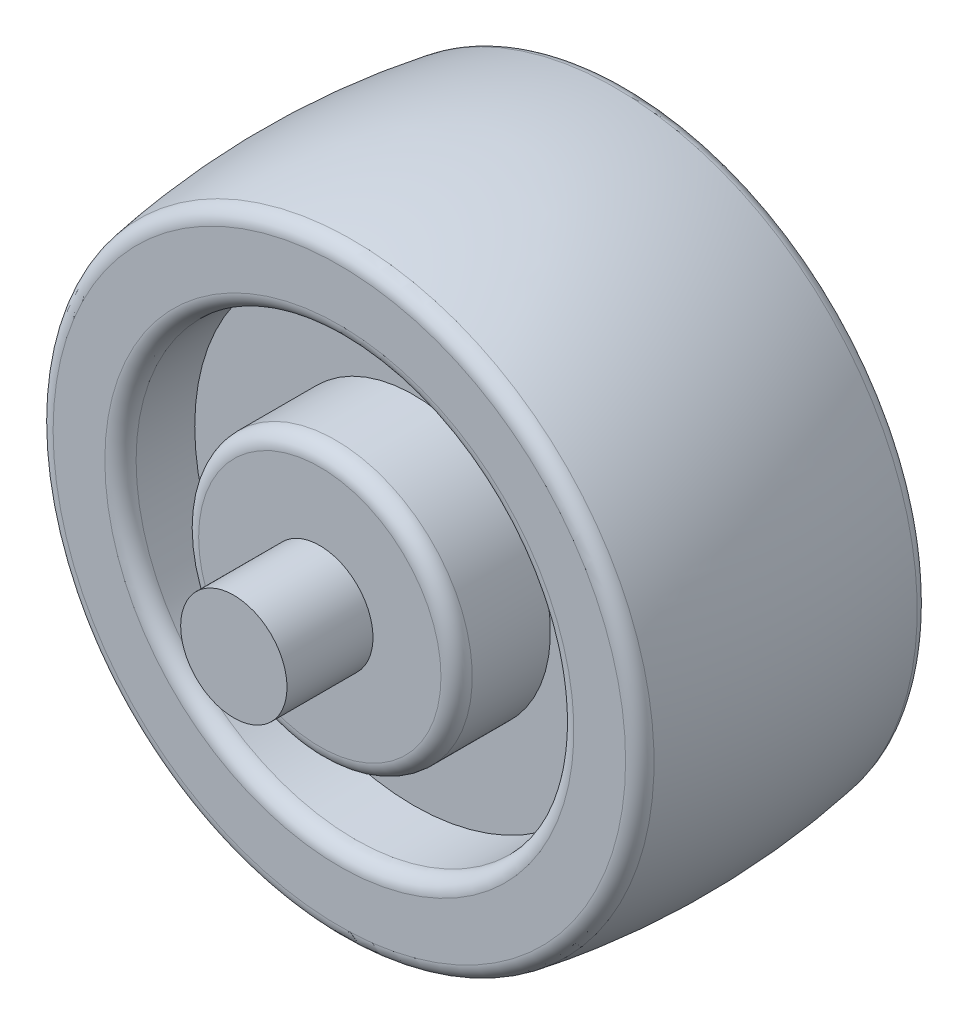
ISO-10303-21;
HEADER;
FILE_DESCRIPTION(('STEP AP214'),'2;1');
FILE_NAME('part.step','',(''),(''),'','','');
FILE_SCHEMA(('AUTOMOTIVE_DESIGN { 1 0 10303 214 1 1 1 1 }'));
ENDSEC;
DATA;
#1=APPLICATION_CONTEXT('core data for automotive mechanical design processes');
#2=APPLICATION_PROTOCOL_DEFINITION('international standard','automotive_design',2000,#1);
#3=PRODUCT_CONTEXT('',#1,'mechanical');
#4=PRODUCT('Part','Part','',(#3));
#5=PRODUCT_RELATED_PRODUCT_CATEGORY('part','',(#4));
#6=PRODUCT_DEFINITION_FORMATION('','',#4);
#7=PRODUCT_DEFINITION_CONTEXT('part definition',#1,'design');
#8=PRODUCT_DEFINITION('design','',#6,#7);
#9=PRODUCT_DEFINITION_SHAPE('','',#8);
#10=(LENGTH_UNIT() NAMED_UNIT(*) SI_UNIT(.MILLI.,.METRE.));
#11=(NAMED_UNIT(*) PLANE_ANGLE_UNIT() SI_UNIT($,.RADIAN.));
#12=(NAMED_UNIT(*) SI_UNIT($,.STERADIAN.) SOLID_ANGLE_UNIT());
#13=UNCERTAINTY_MEASURE_WITH_UNIT(LENGTH_MEASURE(1.E-05),#10,'distance_accuracy_value','');
#14=(GEOMETRIC_REPRESENTATION_CONTEXT(3) GLOBAL_UNCERTAINTY_ASSIGNED_CONTEXT((#13)) GLOBAL_UNIT_ASSIGNED_CONTEXT((#10,
#11,#12)) REPRESENTATION_CONTEXT('',''));
#15=CARTESIAN_POINT('',(0.,0.,0.));
#16=DIRECTION('',(0.,0.,1.));
#17=DIRECTION('',(1.,0.,0.));
#18=AXIS2_PLACEMENT_3D('',#15,#16,#17);
#19=CARTESIAN_POINT('',(0.,0.,-8.99999999999985));
#20=DIRECTION('',(0.,0.,-1.));
#21=DIRECTION('',(-1.,0.,0.));
#22=AXIS2_PLACEMENT_3D('',#19,#20,#21);
#23=DEGENERATE_TOROIDAL_SURFACE('',#22,1.39999999999985,2.00000000000015,.T.);
#24=CARTESIAN_POINT('',(-2.5,-1.07891413116129,-10.4999993737728));
#25=CARTESIAN_POINT('',(-2.5,-1.06285294349331,-10.5056119828645));
#26=CARTESIAN_POINT('',(-2.5,-1.04669158400781,-10.5110809645536));
#27=CARTESIAN_POINT('',(-2.5,-0.863880296138809,-10.5709997012819));
#28=CARTESIAN_POINT('',(-2.5,-0.69425513791531,-10.6087139897874));
#29=CARTESIAN_POINT('',(-2.5,-0.348366003671523,-10.6585810203156));
#30=CARTESIAN_POINT('',(-2.5,-0.174223843179735,-10.6703293088489));
#31=CARTESIAN_POINT('',(-2.5,0.183884168630542,-10.6703293088489));
#32=CARTESIAN_POINT('',(-2.5,0.366145032993408,-10.6573559735582));
#33=CARTESIAN_POINT('',(-2.5,0.728578946840113,-10.6022205843897));
#34=CARTESIAN_POINT('',(-2.5,0.905925810709308,-10.5604503184748));
#35=CARTESIAN_POINT('',(-2.5,1.0789126789543,-10.4999998812421));
#36=B_SPLINE_CURVE_WITH_KNOTS('',3,(#24,#25,#26,#27,#28,#29,#30,#31,#32,#33,#34,#35),
.UNSPECIFIED.,.F.,.F.,(4,2,2,2,2,4),(11.4128770088824,11.4629135358959,11.9802909447386,
12.4976683535814,13.0437331915332,13.5897980294849),.UNSPECIFIED.);
#37=CARTESIAN_POINT('',(-2.5,-1.07891233911283,-10.5));
#38=VERTEX_POINT('',#37);
#39=CARTESIAN_POINT('',(-2.5,1.07891233911283,-10.5));
#40=VERTEX_POINT('',#39);
#41=EDGE_CURVE('E120',#38,#40,#36,.T.);
#42=ORIENTED_EDGE('',*,*,#41,.F.);
#43=CARTESIAN_POINT('',(0.,0.,-10.5));
#44=DIRECTION('',(0.,0.,1.));
#45=DIRECTION('',(-0.918146957948897,0.39624003281999,0.));
#46=AXIS2_PLACEMENT_3D('',#43,#44,#45);
#47=CIRCLE('',#46,2.7228756555322);
#48=EDGE_CURVE('E107',#40,#38,#47,.T.);
#49=ORIENTED_EDGE('',*,*,#48,.F.);
#50=EDGE_LOOP('',(#42,#49));
#51=FACE_BOUND('',#50,.T.);
#52=ADVANCED_FACE('F16',(#51),#23,.T.);
#53=CARTESIAN_POINT('',(-2.5,2.17,-16.));
#54=DIRECTION('',(-1.,0.,0.));
#55=DIRECTION('',(0.,0.,1.));
#56=AXIS2_PLACEMENT_3D('',#53,#54,#55);
#57=PLANE('',#56);
#58=DIRECTION('',(0.,-1.,0.));
#59=VECTOR('',#58,1.);
#60=CARTESIAN_POINT('',(-2.5,2.17,-10.5));
#61=LINE('',#60,#59);
#62=CARTESIAN_POINT('',(-2.5,2.17,-10.5));
#63=VERTEX_POINT('',#62);
#64=EDGE_CURVE('E116',#63,#40,#61,.T.);
#65=ORIENTED_EDGE('',*,*,#64,.F.);
#66=DIRECTION('',(0.,0.,1.));
#67=VECTOR('',#66,1.);
#68=CARTESIAN_POINT('',(-2.5,2.17,-16.));
#69=LINE('',#68,#67);
#70=CARTESIAN_POINT('',(-2.5,2.17,-16.));
#71=VERTEX_POINT('',#70);
#72=EDGE_CURVE('E475',#71,#63,#69,.T.);
#73=ORIENTED_EDGE('',*,*,#72,.F.);
#74=DIRECTION('',(0.,-1.,0.));
#75=VECTOR('',#74,1.);
#76=CARTESIAN_POINT('',(-2.5,2.17,-16.));
#77=LINE('',#76,#75);
#78=CARTESIAN_POINT('',(-2.5,-2.17,-16.));
#79=VERTEX_POINT('',#78);
#80=EDGE_CURVE('E493',#71,#79,#77,.T.);
#81=ORIENTED_EDGE('',*,*,#80,.T.);
#82=DIRECTION('',(0.,0.,1.));
#83=VECTOR('',#82,1.);
#84=CARTESIAN_POINT('',(-2.5,-2.17,-16.));
#85=LINE('',#84,#83);
#86=CARTESIAN_POINT('',(-2.5,-2.17,-10.5));
#87=VERTEX_POINT('',#86);
#88=EDGE_CURVE('E127',#79,#87,#85,.T.);
#89=ORIENTED_EDGE('',*,*,#88,.T.);
#90=DIRECTION('',(0.,-1.,0.));
#91=VECTOR('',#90,1.);
#92=CARTESIAN_POINT('',(-2.5,-1.07891233911283,-10.5));
#93=LINE('',#92,#91);
#94=EDGE_CURVE('E113',#38,#87,#93,.T.);
#95=ORIENTED_EDGE('',*,*,#94,.F.);
#96=ORIENTED_EDGE('',*,*,#41,.T.);
#97=EDGE_LOOP('',(#65,#73,#81,#89,#95,#96));
#98=FACE_BOUND('',#97,.T.);
#99=ADVANCED_FACE('F124',(#98),#57,.T.);
#100=CARTESIAN_POINT('',(0.,7.75,-10.5));
#101=DIRECTION('',(0.,0.,1.));
#102=DIRECTION('',(1.,0.,0.));
#103=AXIS2_PLACEMENT_3D('',#100,#101,#102);
#104=PLANE('',#103);
#105=DIRECTION('',(-1.,0.,0.));
#106=VECTOR('',#105,1.);
#107=CARTESIAN_POINT('',(2.17,2.5,-10.5));
#108=LINE('',#107,#106);
#109=CARTESIAN_POINT('',(2.17,2.5,-10.5));
#110=VERTEX_POINT('',#109);
#111=CARTESIAN_POINT('',(1.07891233911283,2.5,-10.5));
#112=VERTEX_POINT('',#111);
#113=EDGE_CURVE('E128',#110,#112,#108,.T.);
#114=ORIENTED_EDGE('',*,*,#113,.T.);
#115=CARTESIAN_POINT('',(0.,0.,-10.5));
#116=DIRECTION('',(0.,0.,1.));
#117=DIRECTION('',(0.396240032819989,0.918146957948897,0.));
#118=AXIS2_PLACEMENT_3D('',#115,#116,#117);
#119=CIRCLE('',#118,2.7228756555322);
#120=CARTESIAN_POINT('',(-1.07891233911283,2.5,-10.5));
#121=VERTEX_POINT('',#120);
#122=EDGE_CURVE('E480',#112,#121,#119,.T.);
#123=ORIENTED_EDGE('',*,*,#122,.T.);
#124=DIRECTION('',(-1.,0.,0.));
#125=VECTOR('',#124,1.);
#126=CARTESIAN_POINT('',(-1.07891233911283,2.5,-10.5));
#127=LINE('',#126,#125);
#128=CARTESIAN_POINT('',(-2.17,2.5,-10.5));
#129=VERTEX_POINT('',#128);
#130=EDGE_CURVE('E477',#121,#129,#127,.T.);
#131=ORIENTED_EDGE('',*,*,#130,.T.);
#132=CARTESIAN_POINT('',(-2.17000000000013,2.17000000000013,-10.5));
#133=DIRECTION('',(0.,0.,1.));
#134=DIRECTION('',(4.09100363013557E-13,1.,0.));
#135=AXIS2_PLACEMENT_3D('',#132,#133,#134);
#136=CIRCLE('',#135,0.329999999999866);
#137=EDGE_CURVE('E474',#129,#63,#136,.T.);
#138=ORIENTED_EDGE('',*,*,#137,.T.);
#139=ORIENTED_EDGE('',*,*,#64,.T.);
#140=ORIENTED_EDGE('',*,*,#48,.T.);
#141=ORIENTED_EDGE('',*,*,#94,.T.);
#142=CARTESIAN_POINT('',(-2.17000000000013,-2.17000000000013,-10.5));
#143=DIRECTION('',(0.,0.,1.));
#144=DIRECTION('',(-1.,4.09100363013557E-13,0.));
#145=AXIS2_PLACEMENT_3D('',#142,#143,#144);
#146=CIRCLE('',#145,0.329999999999866);
#147=CARTESIAN_POINT('',(-2.17,-2.5,-10.5));
#148=VERTEX_POINT('',#147);
#149=EDGE_CURVE('E476',#87,#148,#146,.T.);
#150=ORIENTED_EDGE('',*,*,#149,.T.);
#151=DIRECTION('',(1.,0.,0.));
#152=VECTOR('',#151,1.);
#153=CARTESIAN_POINT('',(-2.17,-2.5,-10.5));
#154=LINE('',#153,#152);
#155=CARTESIAN_POINT('',(-1.07891233911283,-2.5,-10.5));
#156=VERTEX_POINT('',#155);
#157=EDGE_CURVE('E441',#148,#156,#154,.T.);
#158=ORIENTED_EDGE('',*,*,#157,.T.);
#159=CARTESIAN_POINT('',(0.,0.,-10.5));
#160=DIRECTION('',(0.,0.,1.));
#161=DIRECTION('',(-0.39624003281999,-0.918146957948897,0.));
#162=AXIS2_PLACEMENT_3D('',#159,#160,#161);
#163=CIRCLE('',#162,2.7228756555322);
#164=CARTESIAN_POINT('',(1.07891233911283,-2.5,-10.5));
#165=VERTEX_POINT('',#164);
#166=EDGE_CURVE('E437',#156,#165,#163,.T.);
#167=ORIENTED_EDGE('',*,*,#166,.T.);
#168=DIRECTION('',(1.,0.,0.));
#169=VECTOR('',#168,1.);
#170=CARTESIAN_POINT('',(1.07891233911283,-2.5,-10.5));
#171=LINE('',#170,#169);
#172=CARTESIAN_POINT('',(2.17,-2.5,-10.5));
#173=VERTEX_POINT('',#172);
#174=EDGE_CURVE('E433',#165,#173,#171,.T.);
#175=ORIENTED_EDGE('',*,*,#174,.T.);
#176=CARTESIAN_POINT('',(2.17000000000013,-2.17000000000013,-10.5));
#177=DIRECTION('',(0.,0.,1.));
#178=DIRECTION('',(-4.09100363013557E-13,-1.,0.));
#179=AXIS2_PLACEMENT_3D('',#176,#177,#178);
#180=CIRCLE('',#179,0.329999999999866);
#181=CARTESIAN_POINT('',(2.5,-2.17,-10.5));
#182=VERTEX_POINT('',#181);
#183=EDGE_CURVE('E436',#173,#182,#180,.T.);
#184=ORIENTED_EDGE('',*,*,#183,.T.);
#185=DIRECTION('',(0.,1.,0.));
#186=VECTOR('',#185,1.);
#187=CARTESIAN_POINT('',(2.5,-2.17,-10.5));
#188=LINE('',#187,#186);
#189=CARTESIAN_POINT('',(2.5,-1.07891233911283,-10.5));
#190=VERTEX_POINT('',#189);
#191=EDGE_CURVE('E439',#182,#190,#188,.T.);
#192=ORIENTED_EDGE('',*,*,#191,.T.);
#193=CARTESIAN_POINT('',(0.,0.,-10.5));
#194=DIRECTION('',(0.,0.,1.));
#195=DIRECTION('',(0.918146957948897,-0.39624003281999,0.));
#196=AXIS2_PLACEMENT_3D('',#193,#194,#195);
#197=CIRCLE('',#196,2.7228756555322);
#198=CARTESIAN_POINT('',(2.5,1.07891233911283,-10.5));
#199=VERTEX_POINT('',#198);
#200=EDGE_CURVE('E451',#190,#199,#197,.T.);
#201=ORIENTED_EDGE('',*,*,#200,.T.);
#202=DIRECTION('',(0.,1.,0.));
#203=VECTOR('',#202,1.);
#204=CARTESIAN_POINT('',(2.5,1.07891233911283,-10.5));
#205=LINE('',#204,#203);
#206=CARTESIAN_POINT('',(2.5,2.17000000000013,-10.5));
#207=VERTEX_POINT('',#206);
#208=EDGE_CURVE('E342',#199,#207,#205,.T.);
#209=ORIENTED_EDGE('',*,*,#208,.T.);
#210=CARTESIAN_POINT('',(2.17000000000013,2.17000000000013,-10.5));
#211=DIRECTION('',(0.,0.,1.));
#212=DIRECTION('',(1.,0.,0.));
#213=AXIS2_PLACEMENT_3D('',#210,#211,#212);
#214=CIRCLE('',#213,0.329999999999866);
#215=EDGE_CURVE('E337',#207,#110,#214,.T.);
#216=ORIENTED_EDGE('',*,*,#215,.T.);
#217=EDGE_LOOP('',(#114,#123,#131,#138,#139,#140,#141,#150,#158,#167,#175,#184,#192,#201,#209,#216));
#218=FACE_BOUND('',#217,.T.);
#219=CARTESIAN_POINT('',(0.,0.,-10.5));
#220=DIRECTION('',(0.,0.,-1.));
#221=DIRECTION('',(-1.,0.,0.));
#222=AXIS2_PLACEMENT_3D('',#219,#220,#221);
#223=CIRCLE('',#222,7.74999995529721);
#224=CARTESIAN_POINT('',(-7.74999995529721,0.,-10.5));
#225=VERTEX_POINT('',#224);
#226=EDGE_CURVE('E335',#225,#225,#223,.T.);
#227=ORIENTED_EDGE('',*,*,#226,.T.);
#228=EDGE_LOOP('',(#227));
#229=FACE_BOUND('',#228,.T.);
#230=ADVANCED_FACE('F110',(#218,#229),#104,.F.);
#231=CARTESIAN_POINT('',(-2.17000000000013,2.17000000000013,-16.));
#232=DIRECTION('',(0.,0.,1.));
#233=DIRECTION('',(1.,0.,0.));
#234=AXIS2_PLACEMENT_3D('',#231,#232,#233);
#235=CYLINDRICAL_SURFACE('',#234,0.329999999999866);
#236=ORIENTED_EDGE('',*,*,#137,.F.);
#237=DIRECTION('',(0.,0.,1.));
#238=VECTOR('',#237,1.);
#239=CARTESIAN_POINT('',(-2.17,2.5,-16.));
#240=LINE('',#239,#238);
#241=CARTESIAN_POINT('',(-2.17,2.5,-16.));
#242=VERTEX_POINT('',#241);
#243=EDGE_CURVE('E336',#242,#129,#240,.T.);
#244=ORIENTED_EDGE('',*,*,#243,.F.);
#245=CARTESIAN_POINT('',(-2.17000000000013,2.17000000000013,-16.));
#246=DIRECTION('',(0.,0.,1.));
#247=DIRECTION('',(4.09100363013557E-13,1.,0.));
#248=AXIS2_PLACEMENT_3D('',#245,#246,#247);
#249=CIRCLE('',#248,0.329999999999866);
#250=EDGE_CURVE('E339',#242,#71,#249,.T.);
#251=ORIENTED_EDGE('',*,*,#250,.T.);
#252=ORIENTED_EDGE('',*,*,#72,.T.);
#253=EDGE_LOOP('',(#236,#244,#251,#252));
#254=FACE_BOUND('',#253,.T.);
#255=ADVANCED_FACE('F472',(#254),#235,.T.);
#256=CARTESIAN_POINT('',(-2.17000000000013,-2.17000000000013,-16.));
#257=DIRECTION('',(0.,0.,1.));
#258=DIRECTION('',(1.,0.,0.));
#259=AXIS2_PLACEMENT_3D('',#256,#257,#258);
#260=PLANE('',#259);
#261=ORIENTED_EDGE('',*,*,#80,.F.);
#262=ORIENTED_EDGE('',*,*,#250,.F.);
#263=DIRECTION('',(-1.,0.,0.));
#264=VECTOR('',#263,1.);
#265=CARTESIAN_POINT('',(2.17,2.5,-16.));
#266=LINE('',#265,#264);
#267=CARTESIAN_POINT('',(2.17,2.5,-16.));
#268=VERTEX_POINT('',#267);
#269=EDGE_CURVE('E351',#268,#242,#266,.T.);
#270=ORIENTED_EDGE('',*,*,#269,.F.);
#271=CARTESIAN_POINT('',(2.17000000000013,2.17000000000013,-16.));
#272=DIRECTION('',(0.,0.,1.));
#273=DIRECTION('',(1.,0.,0.));
#274=AXIS2_PLACEMENT_3D('',#271,#272,#273);
#275=CIRCLE('',#274,0.329999999999866);
#276=CARTESIAN_POINT('',(2.5,2.17,-16.));
#277=VERTEX_POINT('',#276);
#278=EDGE_CURVE('E355',#277,#268,#275,.T.);
#279=ORIENTED_EDGE('',*,*,#278,.F.);
#280=DIRECTION('',(0.,1.,0.));
#281=VECTOR('',#280,1.);
#282=CARTESIAN_POINT('',(2.5,-2.17,-16.));
#283=LINE('',#282,#281);
#284=CARTESIAN_POINT('',(2.5,-2.17,-16.));
#285=VERTEX_POINT('',#284);
#286=EDGE_CURVE('E359',#285,#277,#283,.T.);
#287=ORIENTED_EDGE('',*,*,#286,.F.);
#288=CARTESIAN_POINT('',(2.17000000000013,-2.17000000000013,-16.));
#289=DIRECTION('',(0.,0.,1.));
#290=DIRECTION('',(-4.09100363013557E-13,-1.,0.));
#291=AXIS2_PLACEMENT_3D('',#288,#289,#290);
#292=CIRCLE('',#291,0.329999999999866);
#293=CARTESIAN_POINT('',(2.17,-2.5,-16.));
#294=VERTEX_POINT('',#293);
#295=EDGE_CURVE('E364',#294,#285,#292,.T.);
#296=ORIENTED_EDGE('',*,*,#295,.F.);
#297=DIRECTION('',(1.,0.,0.));
#298=VECTOR('',#297,1.);
#299=CARTESIAN_POINT('',(-2.17,-2.5,-16.));
#300=LINE('',#299,#298);
#301=CARTESIAN_POINT('',(-2.17,-2.5,-16.));
#302=VERTEX_POINT('',#301);
#303=EDGE_CURVE('E368',#302,#294,#300,.T.);
#304=ORIENTED_EDGE('',*,*,#303,.F.);
#305=CARTESIAN_POINT('',(-2.17000000000013,-2.17000000000013,-16.));
#306=DIRECTION('',(0.,0.,1.));
#307=DIRECTION('',(-1.,4.09100363013557E-13,0.));
#308=AXIS2_PLACEMENT_3D('',#305,#306,#307);
#309=CIRCLE('',#308,0.329999999999866);
#310=EDGE_CURVE('E372',#79,#302,#309,.T.);
#311=ORIENTED_EDGE('',*,*,#310,.F.);
#312=EDGE_LOOP('',(#261,#262,#270,#279,#287,#296,#304,#311));
#313=FACE_BOUND('',#312,.T.);
#314=ADVANCED_FACE('F466',(#313),#260,.F.);
#315=CARTESIAN_POINT('',(-2.17000000000013,-2.17000000000013,-16.));
#316=DIRECTION('',(0.,0.,1.));
#317=DIRECTION('',(1.,0.,0.));
#318=AXIS2_PLACEMENT_3D('',#315,#316,#317);
#319=CYLINDRICAL_SURFACE('',#318,0.329999999999866);
#320=ORIENTED_EDGE('',*,*,#149,.F.);
#321=ORIENTED_EDGE('',*,*,#88,.F.);
#322=ORIENTED_EDGE('',*,*,#310,.T.);
#323=DIRECTION('',(0.,0.,1.));
#324=VECTOR('',#323,1.);
#325=CARTESIAN_POINT('',(-2.17,-2.5,-16.));
#326=LINE('',#325,#324);
#327=EDGE_CURVE('E31',#302,#148,#326,.T.);
#328=ORIENTED_EDGE('',*,*,#327,.T.);
#329=EDGE_LOOP('',(#320,#321,#322,#328));
#330=FACE_BOUND('',#329,.T.);
#331=ADVANCED_FACE('F405',(#330),#319,.T.);
#332=CARTESIAN_POINT('',(2.17,2.5,-16.));
#333=DIRECTION('',(0.,1.,0.));
#334=DIRECTION('',(0.,0.,1.));
#335=AXIS2_PLACEMENT_3D('',#332,#333,#334);
#336=PLANE('',#335);
#337=ORIENTED_EDGE('',*,*,#113,.F.);
#338=DIRECTION('',(0.,0.,1.));
#339=VECTOR('',#338,1.);
#340=CARTESIAN_POINT('',(2.17,2.5,-16.));
#341=LINE('',#340,#339);
#342=EDGE_CURVE('E380',#268,#110,#341,.T.);
#343=ORIENTED_EDGE('',*,*,#342,.F.);
#344=ORIENTED_EDGE('',*,*,#269,.T.);
#345=ORIENTED_EDGE('',*,*,#243,.T.);
#346=ORIENTED_EDGE('',*,*,#130,.F.);
#347=CARTESIAN_POINT('',(-1.07891413116129,2.5,-10.4999993737728));
#348=CARTESIAN_POINT('',(-1.06285294349331,2.5,-10.5056119828645));
#349=CARTESIAN_POINT('',(-1.04669158400781,2.5,-10.5110809645536));
#350=CARTESIAN_POINT('',(-0.863880296138806,2.5,-10.5709997012819));
#351=CARTESIAN_POINT('',(-0.694255137915307,2.5,-10.6087139897874));
#352=CARTESIAN_POINT('',(-0.348366003671525,2.5,-10.6585810203156));
#353=CARTESIAN_POINT('',(-0.174223843179749,2.5,-10.6703293088489));
#354=CARTESIAN_POINT('',(0.183884168630528,2.5,-10.6703293088489));
#355=CARTESIAN_POINT('',(0.366619874414254,2.5,-10.6572837381367));
#356=CARTESIAN_POINT('',(0.637733047668014,2.5,-10.6160405493926));
#357=CARTESIAN_POINT('',(0.726584260967987,2.5,-10.5988183872929));
#358=CARTESIAN_POINT('',(0.859597647037045,2.5,-10.5666727702142));
#359=CARTESIAN_POINT('',(0.903679885365165,2.5,-10.5549447412132));
#360=CARTESIAN_POINT('',(0.991636632178508,2.5,-10.5291963207627));
#361=CARTESIAN_POINT('',(1.03552596041097,2.5,-10.5151614142107));
#362=CARTESIAN_POINT('',(1.0789126789543,2.5,-10.4999998812421));
#363=B_SPLINE_CURVE_WITH_KNOTS('',3,(#347,#348,#349,#350,#351,#352,#353,#354,#355,#356,#357,
#358,#359,#360,#361,#362),.UNSPECIFIED.,.F.,.F.,(4,2,2,2,2,2,2,4),(11.4128770088824,
11.4629135358959,11.9802909447387,12.4976683535814,13.0437331915332,13.3167656105091,
13.453281819997,13.5897980294849),.UNSPECIFIED.);
#364=EDGE_CURVE('E384',#121,#112,#363,.T.);
#365=ORIENTED_EDGE('',*,*,#364,.T.);
#366=EDGE_LOOP('',(#337,#343,#344,#345,#346,#365));
#367=FACE_BOUND('',#366,.T.);
#368=ADVANCED_FACE('F396',(#367),#336,.T.);
#369=ORIENTED_EDGE('',*,*,#364,.F.);
#370=ORIENTED_EDGE('',*,*,#122,.F.);
#371=EDGE_LOOP('',(#369,#370));
#372=FACE_BOUND('',#371,.T.);
#373=ADVANCED_FACE('F145',(#372),#23,.T.);
#374=CARTESIAN_POINT('',(-2.17,-2.5,-16.));
#375=DIRECTION('',(0.,-1.,0.));
#376=DIRECTION('',(0.,0.,-1.));
#377=AXIS2_PLACEMENT_3D('',#374,#375,#376);
#378=PLANE('',#377);
#379=ORIENTED_EDGE('',*,*,#157,.F.);
#380=ORIENTED_EDGE('',*,*,#327,.F.);
#381=ORIENTED_EDGE('',*,*,#303,.T.);
#382=DIRECTION('',(0.,0.,1.));
#383=VECTOR('',#382,1.);
#384=CARTESIAN_POINT('',(2.17,-2.5,-16.));
#385=LINE('',#384,#383);
#386=EDGE_CURVE('E39',#294,#173,#385,.T.);
#387=ORIENTED_EDGE('',*,*,#386,.T.);
#388=ORIENTED_EDGE('',*,*,#174,.F.);
#389=CARTESIAN_POINT('',(1.07891413116129,-2.5,-10.4999993737728));
#390=CARTESIAN_POINT('',(1.06285294349331,-2.5,-10.5056119828645));
#391=CARTESIAN_POINT('',(1.04669158400781,-2.5,-10.5110809645536));
#392=CARTESIAN_POINT('',(0.863880296138806,-2.5,-10.5709997012819));
#393=CARTESIAN_POINT('',(0.694255137915308,-2.5,-10.6087139897874));
#394=CARTESIAN_POINT('',(0.348366003671525,-2.5,-10.6585810203156));
#395=CARTESIAN_POINT('',(0.174223843179749,-2.5,-10.6703293088489));
#396=CARTESIAN_POINT('',(-0.183884168630529,-2.5,-10.6703293088489));
#397=CARTESIAN_POINT('',(-0.366619874414255,-2.5,-10.6572837381367));
#398=CARTESIAN_POINT('',(-0.637733047668015,-2.5,-10.6160405493926));
#399=CARTESIAN_POINT('',(-0.726584260967985,-2.5,-10.5988183872929));
#400=CARTESIAN_POINT('',(-0.859597647037045,-2.5,-10.5666727702142));
#401=CARTESIAN_POINT('',(-0.903679885365168,-2.5,-10.5549447412132));
#402=CARTESIAN_POINT('',(-0.991636632178511,-2.5,-10.5291963207627));
#403=CARTESIAN_POINT('',(-1.03552596041097,-2.5,-10.5151614142107));
#404=CARTESIAN_POINT('',(-1.0789126789543,-2.5,-10.4999998812421));
#405=B_SPLINE_CURVE_WITH_KNOTS('',3,(#389,#390,#391,#392,#393,#394,#395,#396,#397,#398,#399,
#400,#401,#402,#403,#404),.UNSPECIFIED.,.F.,.F.,(4,2,2,2,2,2,2,4),(11.4128770088824,
11.4629135358959,11.9802909447386,12.4976683535814,13.0437331915332,13.3167656105091,
13.453281819997,13.5897980294849),.UNSPECIFIED.);
#406=EDGE_CURVE('E172',#165,#156,#405,.T.);
#407=ORIENTED_EDGE('',*,*,#406,.T.);
#408=EDGE_LOOP('',(#379,#380,#381,#387,#388,#407));
#409=FACE_BOUND('',#408,.T.);
#410=ADVANCED_FACE('F407',(#409),#378,.T.);
#411=ORIENTED_EDGE('',*,*,#406,.F.);
#412=ORIENTED_EDGE('',*,*,#166,.F.);
#413=EDGE_LOOP('',(#411,#412));
#414=FACE_BOUND('',#413,.T.);
#415=ADVANCED_FACE('F410',(#414),#23,.T.);
#416=CARTESIAN_POINT('',(2.17000000000013,-2.17000000000013,-16.));
#417=DIRECTION('',(0.,0.,1.));
#418=DIRECTION('',(1.,0.,0.));
#419=AXIS2_PLACEMENT_3D('',#416,#417,#418);
#420=CYLINDRICAL_SURFACE('',#419,0.329999999999866);
#421=ORIENTED_EDGE('',*,*,#183,.F.);
#422=ORIENTED_EDGE('',*,*,#386,.F.);
#423=ORIENTED_EDGE('',*,*,#295,.T.);
#424=DIRECTION('',(0.,0.,1.));
#425=VECTOR('',#424,1.);
#426=CARTESIAN_POINT('',(2.5,-2.17,-16.));
#427=LINE('',#426,#425);
#428=EDGE_CURVE('E163',#285,#182,#427,.T.);
#429=ORIENTED_EDGE('',*,*,#428,.T.);
#430=EDGE_LOOP('',(#421,#422,#423,#429));
#431=FACE_BOUND('',#430,.T.);
#432=ADVANCED_FACE('F198',(#431),#420,.T.);
#433=CARTESIAN_POINT('',(2.5,-2.17,-16.));
#434=DIRECTION('',(1.,0.,0.));
#435=DIRECTION('',(0.,0.,-1.));
#436=AXIS2_PLACEMENT_3D('',#433,#434,#435);
#437=PLANE('',#436);
#438=ORIENTED_EDGE('',*,*,#191,.F.);
#439=ORIENTED_EDGE('',*,*,#428,.F.);
#440=ORIENTED_EDGE('',*,*,#286,.T.);
#441=DIRECTION('',(0.,0.,1.));
#442=VECTOR('',#441,1.);
#443=CARTESIAN_POINT('',(2.5,2.17,-16.));
#444=LINE('',#443,#442);
#445=EDGE_CURVE('E171',#277,#207,#444,.T.);
#446=ORIENTED_EDGE('',*,*,#445,.T.);
#447=ORIENTED_EDGE('',*,*,#208,.F.);
#448=CARTESIAN_POINT('',(2.5,1.07891413116129,-10.4999993737728));
#449=CARTESIAN_POINT('',(2.5,1.06285294349331,-10.5056119828645));
#450=CARTESIAN_POINT('',(2.5,1.04669158400781,-10.5110809645536));
#451=CARTESIAN_POINT('',(2.5,0.863880296138809,-10.5709997012819));
#452=CARTESIAN_POINT('',(2.5,0.694255137915308,-10.6087139897874));
#453=CARTESIAN_POINT('',(2.5,0.348366003671525,-10.6585810203156));
#454=CARTESIAN_POINT('',(2.5,0.174223843179749,-10.6703293088489));
#455=CARTESIAN_POINT('',(2.5,-0.183884168630529,-10.6703293088489));
#456=CARTESIAN_POINT('',(2.5,-0.366619874414255,-10.6572837381367));
#457=CARTESIAN_POINT('',(2.5,-0.637733047668015,-10.6160405493926));
#458=CARTESIAN_POINT('',(2.5,-0.726584260967986,-10.5988183872929));
#459=CARTESIAN_POINT('',(2.5,-0.859597647037045,-10.5666727702142));
#460=CARTESIAN_POINT('',(2.5,-0.903679885365167,-10.5549447412132));
#461=CARTESIAN_POINT('',(2.5,-0.991636632178509,-10.5291963207627));
#462=CARTESIAN_POINT('',(2.5,-1.03552596041097,-10.5151614142107));
#463=CARTESIAN_POINT('',(2.5,-1.0789126789543,-10.4999998812421));
#464=B_SPLINE_CURVE_WITH_KNOTS('',3,(#448,#449,#450,#451,#452,#453,#454,#455,#456,#457,#458,
#459,#460,#461,#462,#463),.UNSPECIFIED.,.F.,.F.,(4,2,2,2,2,2,2,4),(11.4128770088823,
11.4629135358959,11.9802909447386,12.4976683535814,13.0437331915332,13.316765610509,
13.453281819997,13.5897980294849),.UNSPECIFIED.);
#465=EDGE_CURVE('E177',#199,#190,#464,.T.);
#466=ORIENTED_EDGE('',*,*,#465,.T.);
#467=EDGE_LOOP('',(#438,#439,#440,#446,#447,#466));
#468=FACE_BOUND('',#467,.T.);
#469=ADVANCED_FACE('F188',(#468),#437,.T.);
#470=ORIENTED_EDGE('',*,*,#465,.F.);
#471=ORIENTED_EDGE('',*,*,#200,.F.);
#472=EDGE_LOOP('',(#470,#471));
#473=FACE_BOUND('',#472,.T.);
#474=ADVANCED_FACE('F144',(#473),#23,.T.);
#475=CARTESIAN_POINT('',(2.17000000000013,2.17000000000013,-16.));
#476=DIRECTION('',(0.,0.,1.));
#477=DIRECTION('',(1.,0.,0.));
#478=AXIS2_PLACEMENT_3D('',#475,#476,#477);
#479=CYLINDRICAL_SURFACE('',#478,0.329999999999866);
#480=ORIENTED_EDGE('',*,*,#215,.F.);
#481=ORIENTED_EDGE('',*,*,#445,.F.);
#482=ORIENTED_EDGE('',*,*,#278,.T.);
#483=ORIENTED_EDGE('',*,*,#342,.T.);
#484=EDGE_LOOP('',(#480,#481,#482,#483));
#485=FACE_BOUND('',#484,.T.);
#486=ADVANCED_FACE('F200',(#485),#479,.T.);
#487=CARTESIAN_POINT('',(0.,0.,-9.50000000000069));
#488=DIRECTION('',(0.,0.,-1.));
#489=DIRECTION('',(-1.,0.,0.));
#490=AXIS2_PLACEMENT_3D('',#487,#488,#489);
#491=TOROIDAL_SURFACE('',#490,7.75000000000069,0.99999999999931);
#492=CARTESIAN_POINT('',(0.,0.,-9.5));
#493=DIRECTION('',(0.,0.,-1.));
#494=DIRECTION('',(-1.,0.,0.));
#495=AXIS2_PLACEMENT_3D('',#492,#493,#494);
#496=CIRCLE('',#495,8.75);
#497=CARTESIAN_POINT('',(-8.75,0.,-9.5));
#498=VERTEX_POINT('',#497);
#499=EDGE_CURVE('E322',#498,#498,#496,.T.);
#500=ORIENTED_EDGE('',*,*,#499,.T.);
#501=EDGE_LOOP('',(#500));
#502=FACE_BOUND('',#501,.T.);
#503=ORIENTED_EDGE('',*,*,#226,.F.);
#504=EDGE_LOOP('',(#503));
#505=FACE_BOUND('',#504,.T.);
#506=ADVANCED_FACE('F203',(#502,#505),#491,.T.);
#507=CARTESIAN_POINT('',(0.,0.,-10.5));
#508=DIRECTION('',(0.,0.,-1.));
#509=DIRECTION('',(-1.,0.,0.));
#510=AXIS2_PLACEMENT_3D('',#507,#508,#509);
#511=CYLINDRICAL_SURFACE('',#510,8.75);
#512=ORIENTED_EDGE('',*,*,#499,.F.);
#513=EDGE_LOOP('',(#512));
#514=FACE_BOUND('',#513,.T.);
#515=CARTESIAN_POINT('',(0.,0.,-4.5));
#516=DIRECTION('',(0.,0.,-1.));
#517=DIRECTION('',(-1.,0.,0.));
#518=AXIS2_PLACEMENT_3D('',#515,#516,#517);
#519=CIRCLE('',#518,8.75);
#520=CARTESIAN_POINT('',(-8.75,0.,-4.5));
#521=VERTEX_POINT('',#520);
#522=EDGE_CURVE('E320',#521,#521,#519,.T.);
#523=ORIENTED_EDGE('',*,*,#522,.T.);
#524=EDGE_LOOP('',(#523));
#525=FACE_BOUND('',#524,.T.);
#526=ADVANCED_FACE('F207',(#514,#525),#511,.T.);
#527=CARTESIAN_POINT('',(0.,14.,-4.5));
#528=DIRECTION('',(0.,0.,1.));
#529=DIRECTION('',(1.,0.,0.));
#530=AXIS2_PLACEMENT_3D('',#527,#528,#529);
#531=PLANE('',#530);
#532=ORIENTED_EDGE('',*,*,#522,.F.);
#533=EDGE_LOOP('',(#532));
#534=FACE_BOUND('',#533,.T.);
#535=CARTESIAN_POINT('',(0.,0.,-4.5));
#536=DIRECTION('',(0.,0.,-1.));
#537=DIRECTION('',(-1.,0.,0.));
#538=AXIS2_PLACEMENT_3D('',#535,#536,#537);
#539=CIRCLE('',#538,14.);
#540=CARTESIAN_POINT('',(-14.,0.,-4.5));
#541=VERTEX_POINT('',#540);
#542=EDGE_CURVE('E317',#541,#541,#539,.T.);
#543=ORIENTED_EDGE('',*,*,#542,.T.);
#544=EDGE_LOOP('',(#543));
#545=FACE_BOUND('',#544,.T.);
#546=ADVANCED_FACE('F211',(#534,#545),#531,.F.);
#547=CARTESIAN_POINT('',(0.,0.,-10.5));
#548=DIRECTION('',(0.,0.,-1.));
#549=DIRECTION('',(-1.,0.,0.));
#550=AXIS2_PLACEMENT_3D('',#547,#548,#549);
#551=CYLINDRICAL_SURFACE('',#550,14.);
#552=ORIENTED_EDGE('',*,*,#542,.F.);
#553=EDGE_LOOP('',(#552));
#554=FACE_BOUND('',#553,.T.);
#555=CARTESIAN_POINT('',(0.,0.,-8.25));
#556=DIRECTION('',(0.,0.,-1.));
#557=DIRECTION('',(-1.,0.,0.));
#558=AXIS2_PLACEMENT_3D('',#555,#556,#557);
#559=CIRCLE('',#558,14.);
#560=CARTESIAN_POINT('',(-14.,0.,-8.25));
#561=VERTEX_POINT('',#560);
#562=EDGE_CURVE('E314',#561,#561,#559,.T.);
#563=ORIENTED_EDGE('',*,*,#562,.T.);
#564=EDGE_LOOP('',(#563));
#565=FACE_BOUND('',#564,.T.);
#566=ADVANCED_FACE('F215',(#554,#565),#551,.F.);
#567=CARTESIAN_POINT('',(0.,0.,-8.25000000000069));
#568=DIRECTION('',(0.,0.,-1.));
#569=DIRECTION('',(-1.,0.,0.));
#570=AXIS2_PLACEMENT_3D('',#567,#568,#569);
#571=TOROIDAL_SURFACE('',#570,14.9999999999993,0.999999999999307);
#572=CARTESIAN_POINT('',(0.,0.,-9.25));
#573=DIRECTION('',(0.,0.,-1.));
#574=DIRECTION('',(-1.,0.,0.));
#575=AXIS2_PLACEMENT_3D('',#572,#573,#574);
#576=CIRCLE('',#575,14.9999999999993);
#577=CARTESIAN_POINT('',(-14.9999999999993,0.,-9.25));
#578=VERTEX_POINT('',#577);
#579=EDGE_CURVE('E311',#578,#578,#576,.T.);
#580=ORIENTED_EDGE('',*,*,#579,.T.);
#581=EDGE_LOOP('',(#580));
#582=FACE_BOUND('',#581,.T.);
#583=ORIENTED_EDGE('',*,*,#562,.F.);
#584=EDGE_LOOP('',(#583));
#585=FACE_BOUND('',#584,.T.);
#586=ADVANCED_FACE('F219',(#582,#585),#571,.T.);
#587=CARTESIAN_POINT('',(0.,18.307658210572,-9.25));
#588=DIRECTION('',(0.,0.,1.));
#589=DIRECTION('',(1.,0.,0.));
#590=AXIS2_PLACEMENT_3D('',#587,#588,#589);
#591=PLANE('',#590);
#592=ORIENTED_EDGE('',*,*,#579,.F.);
#593=EDGE_LOOP('',(#592));
#594=FACE_BOUND('',#593,.T.);
#595=CARTESIAN_POINT('',(0.,0.,-9.25));
#596=DIRECTION('',(0.,0.,-1.));
#597=DIRECTION('',(-1.,0.,0.));
#598=AXIS2_PLACEMENT_3D('',#595,#596,#597);
#599=CIRCLE('',#598,18.3076581236845);
#600=CARTESIAN_POINT('',(-18.3076581236845,0.,-9.25));
#601=VERTEX_POINT('',#600);
#602=EDGE_CURVE('E308',#601,#601,#599,.T.);
#603=ORIENTED_EDGE('',*,*,#602,.T.);
#604=EDGE_LOOP('',(#603));
#605=FACE_BOUND('',#604,.T.);
#606=ADVANCED_FACE('F223',(#594,#605),#591,.F.);
#607=CARTESIAN_POINT('',(0.,0.,-8.25000000000082));
#608=DIRECTION('',(0.,0.,-1.));
#609=DIRECTION('',(-1.,0.,0.));
#610=AXIS2_PLACEMENT_3D('',#607,#608,#609);
#611=TOROIDAL_SURFACE('',#610,18.3076582105724,0.999999999999185);
#612=CARTESIAN_POINT('',(0.,0.,-8.4166666666667));
#613=DIRECTION('',(0.,0.,-1.));
#614=DIRECTION('',(-1.,0.,0.));
#615=AXIS2_PLACEMENT_3D('',#612,#613,#614);
#616=CIRCLE('',#615,19.293671507755);
#617=CARTESIAN_POINT('',(-19.293671507755,0.,-8.4166666666667));
#618=VERTEX_POINT('',#617);
#619=EDGE_CURVE('E305',#618,#618,#616,.T.);
#620=ORIENTED_EDGE('',*,*,#619,.T.);
#621=EDGE_LOOP('',(#620));
#622=FACE_BOUND('',#621,.T.);
#623=ORIENTED_EDGE('',*,*,#602,.F.);
#624=EDGE_LOOP('',(#623));
#625=FACE_BOUND('',#624,.T.);
#626=ADVANCED_FACE('F227',(#622,#625),#611,.T.);
#627=CARTESIAN_POINT('',(0.,0.,0.));
#628=DIRECTION('',(0.,0.,-1.));
#629=DIRECTION('',(-1.,0.,0.));
#630=AXIS2_PLACEMENT_3D('',#627,#628,#629);
#631=DEGENERATE_TOROIDAL_SURFACE('',#630,30.4999999999932,50.4999999999932,.F.);
#632=CARTESIAN_POINT('',(0.,0.,8.4166666666667));
#633=DIRECTION('',(0.,0.,-1.));
#634=DIRECTION('',(-1.,0.,0.));
#635=AXIS2_PLACEMENT_3D('',#632,#633,#634);
#636=CIRCLE('',#635,19.293671507755);
#637=CARTESIAN_POINT('',(-19.293671507755,0.,8.4166666666667));
#638=VERTEX_POINT('',#637);
#639=EDGE_CURVE('E302',#638,#638,#636,.T.);
#640=ORIENTED_EDGE('',*,*,#639,.T.);
#641=EDGE_LOOP('',(#640));
#642=FACE_BOUND('',#641,.T.);
#643=ORIENTED_EDGE('',*,*,#619,.F.);
#644=EDGE_LOOP('',(#643));
#645=FACE_BOUND('',#644,.T.);
#646=ADVANCED_FACE('F231',(#642,#645),#631,.F.);
#647=CARTESIAN_POINT('',(0.,0.,8.25000000000082));
#648=DIRECTION('',(0.,0.,-1.));
#649=DIRECTION('',(-1.,0.,0.));
#650=AXIS2_PLACEMENT_3D('',#647,#648,#649);
#651=TOROIDAL_SURFACE('',#650,18.3076582105724,0.999999999999184);
#652=CARTESIAN_POINT('',(0.,0.,9.25));
#653=DIRECTION('',(0.,0.,-1.));
#654=DIRECTION('',(-1.,0.,0.));
#655=AXIS2_PLACEMENT_3D('',#652,#653,#654);
#656=CIRCLE('',#655,18.3076581331437);
#657=CARTESIAN_POINT('',(-18.3076581331437,0.,9.25));
#658=VERTEX_POINT('',#657);
#659=EDGE_CURVE('E299',#658,#658,#656,.T.);
#660=ORIENTED_EDGE('',*,*,#659,.T.);
#661=EDGE_LOOP('',(#660));
#662=FACE_BOUND('',#661,.T.);
#663=ORIENTED_EDGE('',*,*,#639,.F.);
#664=EDGE_LOOP('',(#663));
#665=FACE_BOUND('',#664,.T.);
#666=ADVANCED_FACE('F235',(#662,#665),#651,.T.);
#667=CARTESIAN_POINT('',(0.,15.,9.25));
#668=DIRECTION('',(0.,0.,-1.));
#669=DIRECTION('',(-1.,0.,0.));
#670=AXIS2_PLACEMENT_3D('',#667,#668,#669);
#671=PLANE('',#670);
#672=ORIENTED_EDGE('',*,*,#659,.F.);
#673=EDGE_LOOP('',(#672));
#674=FACE_BOUND('',#673,.T.);
#675=CARTESIAN_POINT('',(0.,0.,9.25));
#676=DIRECTION('',(0.,0.,-1.));
#677=DIRECTION('',(-1.,0.,0.));
#678=AXIS2_PLACEMENT_3D('',#675,#676,#677);
#679=CIRCLE('',#678,14.9999999999993);
#680=CARTESIAN_POINT('',(-14.9999999999993,0.,9.25));
#681=VERTEX_POINT('',#680);
#682=EDGE_CURVE('E296',#681,#681,#679,.T.);
#683=ORIENTED_EDGE('',*,*,#682,.T.);
#684=EDGE_LOOP('',(#683));
#685=FACE_BOUND('',#684,.T.);
#686=ADVANCED_FACE('F239',(#674,#685),#671,.F.);
#687=CARTESIAN_POINT('',(0.,0.,8.25000000000069));
#688=DIRECTION('',(0.,0.,-1.));
#689=DIRECTION('',(-1.,0.,0.));
#690=AXIS2_PLACEMENT_3D('',#687,#688,#689);
#691=TOROIDAL_SURFACE('',#690,14.9999999999993,0.999999999999305);
#692=CARTESIAN_POINT('',(0.,0.,8.25));
#693=DIRECTION('',(0.,0.,-1.));
#694=DIRECTION('',(-1.,0.,0.));
#695=AXIS2_PLACEMENT_3D('',#692,#693,#694);
#696=CIRCLE('',#695,14.);
#697=CARTESIAN_POINT('',(-14.,0.,8.25));
#698=VERTEX_POINT('',#697);
#699=EDGE_CURVE('E293',#698,#698,#696,.T.);
#700=ORIENTED_EDGE('',*,*,#699,.T.);
#701=EDGE_LOOP('',(#700));
#702=FACE_BOUND('',#701,.T.);
#703=ORIENTED_EDGE('',*,*,#682,.F.);
#704=EDGE_LOOP('',(#703));
#705=FACE_BOUND('',#704,.T.);
#706=ADVANCED_FACE('F243',(#702,#705),#691,.T.);
#707=CARTESIAN_POINT('',(0.,0.,-10.5));
#708=DIRECTION('',(0.,0.,-1.));
#709=DIRECTION('',(-1.,0.,0.));
#710=AXIS2_PLACEMENT_3D('',#707,#708,#709);
#711=CYLINDRICAL_SURFACE('',#710,14.);
#712=ORIENTED_EDGE('',*,*,#699,.F.);
#713=EDGE_LOOP('',(#712));
#714=FACE_BOUND('',#713,.T.);
#715=CARTESIAN_POINT('',(0.,0.,4.5));
#716=DIRECTION('',(0.,0.,-1.));
#717=DIRECTION('',(-1.,0.,0.));
#718=AXIS2_PLACEMENT_3D('',#715,#716,#717);
#719=CIRCLE('',#718,14.);
#720=CARTESIAN_POINT('',(-14.,0.,4.5));
#721=VERTEX_POINT('',#720);
#722=EDGE_CURVE('E290',#721,#721,#719,.T.);
#723=ORIENTED_EDGE('',*,*,#722,.T.);
#724=EDGE_LOOP('',(#723));
#725=FACE_BOUND('',#724,.T.);
#726=ADVANCED_FACE('F247',(#714,#725),#711,.F.);
#727=CARTESIAN_POINT('',(0.,8.75,4.5));
#728=DIRECTION('',(0.,0.,-1.));
#729=DIRECTION('',(-1.,0.,0.));
#730=AXIS2_PLACEMENT_3D('',#727,#728,#729);
#731=PLANE('',#730);
#732=ORIENTED_EDGE('',*,*,#722,.F.);
#733=EDGE_LOOP('',(#732));
#734=FACE_BOUND('',#733,.T.);
#735=CARTESIAN_POINT('',(0.,0.,4.5));
#736=DIRECTION('',(0.,0.,-1.));
#737=DIRECTION('',(-1.,0.,0.));
#738=AXIS2_PLACEMENT_3D('',#735,#736,#737);
#739=CIRCLE('',#738,8.75);
#740=CARTESIAN_POINT('',(-8.75,0.,4.5));
#741=VERTEX_POINT('',#740);
#742=EDGE_CURVE('E287',#741,#741,#739,.T.);
#743=ORIENTED_EDGE('',*,*,#742,.T.);
#744=EDGE_LOOP('',(#743));
#745=FACE_BOUND('',#744,.T.);
#746=ADVANCED_FACE('F251',(#734,#745),#731,.F.);
#747=CARTESIAN_POINT('',(0.,0.,-10.5));
#748=DIRECTION('',(0.,0.,-1.));
#749=DIRECTION('',(-1.,0.,0.));
#750=AXIS2_PLACEMENT_3D('',#747,#748,#749);
#751=CYLINDRICAL_SURFACE('',#750,8.75);
#752=ORIENTED_EDGE('',*,*,#742,.F.);
#753=EDGE_LOOP('',(#752));
#754=FACE_BOUND('',#753,.T.);
#755=CARTESIAN_POINT('',(0.,0.,9.5));
#756=DIRECTION('',(0.,0.,-1.));
#757=DIRECTION('',(-1.,0.,0.));
#758=AXIS2_PLACEMENT_3D('',#755,#756,#757);
#759=CIRCLE('',#758,8.75);
#760=CARTESIAN_POINT('',(-8.75,0.,9.5));
#761=VERTEX_POINT('',#760);
#762=EDGE_CURVE('E282',#761,#761,#759,.T.);
#763=ORIENTED_EDGE('',*,*,#762,.T.);
#764=EDGE_LOOP('',(#763));
#765=FACE_BOUND('',#764,.T.);
#766=ADVANCED_FACE('F255',(#754,#765),#751,.T.);
#767=CARTESIAN_POINT('',(0.,0.,9.50000000000069));
#768=DIRECTION('',(0.,0.,-1.));
#769=DIRECTION('',(-1.,0.,0.));
#770=AXIS2_PLACEMENT_3D('',#767,#768,#769);
#771=TOROIDAL_SURFACE('',#770,7.75000000000069,0.99999999999931);
#772=CARTESIAN_POINT('',(0.,0.,10.5));
#773=DIRECTION('',(0.,0.,-1.));
#774=DIRECTION('',(-1.,0.,0.));
#775=AXIS2_PLACEMENT_3D('',#772,#773,#774);
#776=CIRCLE('',#775,7.74999995529721);
#777=CARTESIAN_POINT('',(-7.74999995529721,0.,10.5));
#778=VERTEX_POINT('',#777);
#779=EDGE_CURVE('E280',#778,#778,#776,.T.);
#780=ORIENTED_EDGE('',*,*,#779,.T.);
#781=EDGE_LOOP('',(#780));
#782=FACE_BOUND('',#781,.T.);
#783=ORIENTED_EDGE('',*,*,#762,.F.);
#784=EDGE_LOOP('',(#783));
#785=FACE_BOUND('',#784,.T.);
#786=ADVANCED_FACE('F259',(#782,#785),#771,.T.);
#787=CARTESIAN_POINT('',(0.,0.,10.5));
#788=DIRECTION('',(0.,0.,-1.));
#789=DIRECTION('',(-1.,0.,0.));
#790=AXIS2_PLACEMENT_3D('',#787,#788,#789);
#791=PLANE('',#790);
#792=ORIENTED_EDGE('',*,*,#779,.F.);
#793=EDGE_LOOP('',(#792));
#794=FACE_BOUND('',#793,.T.);
#795=CARTESIAN_POINT('',(0.,0.,10.5));
#796=DIRECTION('',(0.,0.,1.));
#797=DIRECTION('',(-1.,0.,0.));
#798=AXIS2_PLACEMENT_3D('',#795,#796,#797);
#799=CIRCLE('',#798,3.4);
#800=CARTESIAN_POINT('',(-3.4,0.,10.5));
#801=VERTEX_POINT('',#800);
#802=EDGE_CURVE('E24',#801,#801,#799,.T.);
#803=ORIENTED_EDGE('',*,*,#802,.F.);
#804=EDGE_LOOP('',(#803));
#805=FACE_BOUND('',#804,.T.);
#806=ADVANCED_FACE('F263',(#794,#805),#791,.F.);
#807=CARTESIAN_POINT('',(0.,0.,-11.));
#808=DIRECTION('',(0.,0.,-1.));
#809=DIRECTION('',(-1.,0.,0.));
#810=AXIS2_PLACEMENT_3D('',#807,#808,#809);
#811=CYLINDRICAL_SURFACE('',#810,3.4);
#812=ORIENTED_EDGE('',*,*,#802,.T.);
#813=EDGE_LOOP('',(#812));
#814=FACE_BOUND('',#813,.T.);
#815=CARTESIAN_POINT('',(0.,0.,16.));
#816=DIRECTION('',(0.,0.,-1.));
#817=DIRECTION('',(-1.,0.,0.));
#818=AXIS2_PLACEMENT_3D('',#815,#816,#817);
#819=CIRCLE('',#818,3.4);
#820=CARTESIAN_POINT('',(-3.4,0.,16.));
#821=VERTEX_POINT('',#820);
#822=EDGE_CURVE('E11',#821,#821,#819,.T.);
#823=ORIENTED_EDGE('',*,*,#822,.T.);
#824=EDGE_LOOP('',(#823));
#825=FACE_BOUND('',#824,.T.);
#826=ADVANCED_FACE('F266',(#814,#825),#811,.T.);
#827=CARTESIAN_POINT('',(0.,0.,16.));
#828=DIRECTION('',(0.,0.,-1.));
#829=DIRECTION('',(-1.,0.,0.));
#830=AXIS2_PLACEMENT_3D('',#827,#828,#829);
#831=PLANE('',#830);
#832=ORIENTED_EDGE('',*,*,#822,.F.);
#833=EDGE_LOOP('',(#832));
#834=FACE_BOUND('',#833,.T.);
#835=ADVANCED_FACE('F18',(#834),#831,.F.);
#836=CLOSED_SHELL('',(#52,#99,#230,#255,#314,#331,#368,#373,#410,#415,#432,#469,#474,#486,#506,
#526,#546,#566,#586,#606,#626,#646,#666,#686,#706,#726,#746,#766,#786,#806,#826,#835));
#837=MANIFOLD_SOLID_BREP('B1',#836);
#838=ADVANCED_BREP_SHAPE_REPRESENTATION('',(#18,#837),#14);
#839=SHAPE_DEFINITION_REPRESENTATION(#9,#838);
ENDSEC;
END-ISO-10303-21;
